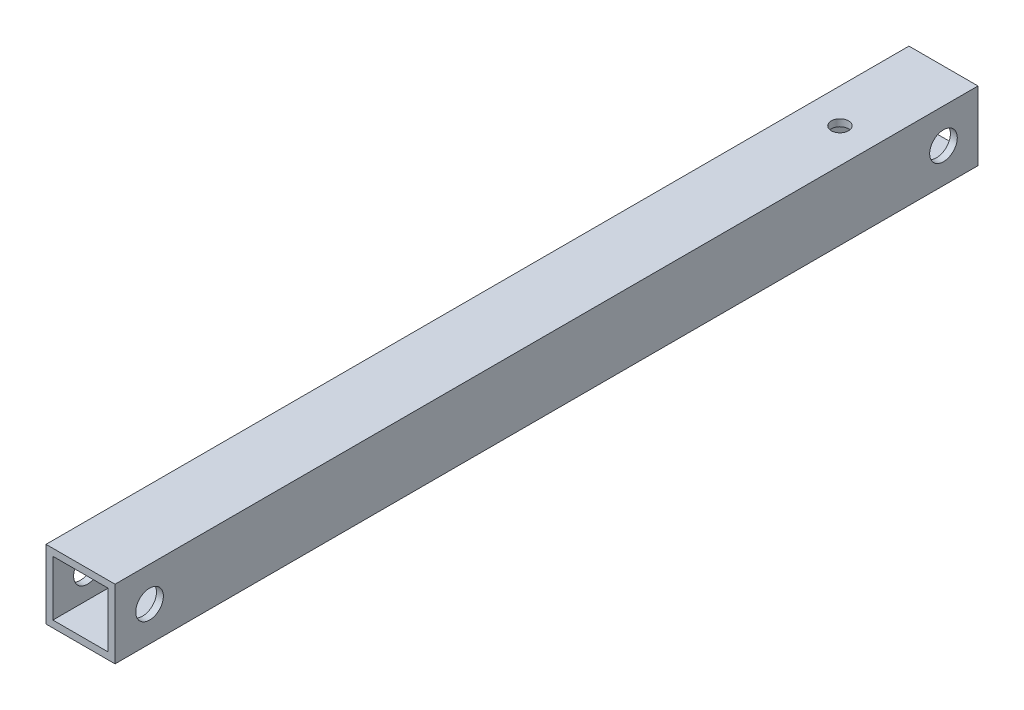
ISO-10303-21;
HEADER;
FILE_DESCRIPTION(('STEP AP214'),'2;1');
FILE_NAME('part.step','',(''),(''),'','','');
FILE_SCHEMA(('AUTOMOTIVE_DESIGN { 1 0 10303 214 1 1 1 1 }'));
ENDSEC;
DATA;
#1=APPLICATION_CONTEXT('core data for automotive mechanical design processes');
#2=APPLICATION_PROTOCOL_DEFINITION('international standard','automotive_design',2000,#1);
#3=PRODUCT_CONTEXT('',#1,'mechanical');
#4=PRODUCT('Part','Part','',(#3));
#5=PRODUCT_RELATED_PRODUCT_CATEGORY('part','',(#4));
#6=PRODUCT_DEFINITION_FORMATION('','',#4);
#7=PRODUCT_DEFINITION_CONTEXT('part definition',#1,'design');
#8=PRODUCT_DEFINITION('design','',#6,#7);
#9=PRODUCT_DEFINITION_SHAPE('','',#8);
#10=(LENGTH_UNIT() NAMED_UNIT(*) SI_UNIT(.MILLI.,.METRE.));
#11=(NAMED_UNIT(*) PLANE_ANGLE_UNIT() SI_UNIT($,.RADIAN.));
#12=(NAMED_UNIT(*) SI_UNIT($,.STERADIAN.) SOLID_ANGLE_UNIT());
#13=UNCERTAINTY_MEASURE_WITH_UNIT(LENGTH_MEASURE(1.E-05),#10,'distance_accuracy_value','');
#14=(GEOMETRIC_REPRESENTATION_CONTEXT(3) GLOBAL_UNCERTAINTY_ASSIGNED_CONTEXT((#13)) GLOBAL_UNIT_ASSIGNED_CONTEXT((#10,
#11,#12)) REPRESENTATION_CONTEXT('',''));
#15=CARTESIAN_POINT('',(0.,0.,0.));
#16=DIRECTION('',(0.,0.,1.));
#17=DIRECTION('',(1.,0.,0.));
#18=AXIS2_PLACEMENT_3D('',#15,#16,#17);
#19=CARTESIAN_POINT('',(0.,0.,250.));
#20=DIRECTION('',(0.,0.,-1.));
#21=DIRECTION('',(-1.,0.,0.));
#22=AXIS2_PLACEMENT_3D('',#19,#20,#21);
#23=PLANE('',#22);
#24=DIRECTION('',(0.,1.,0.));
#25=VECTOR('',#24,1.);
#26=CARTESIAN_POINT('',(10.,-10.,250.));
#27=LINE('',#26,#25);
#28=CARTESIAN_POINT('',(10.,-10.,250.));
#29=VERTEX_POINT('',#28);
#30=CARTESIAN_POINT('',(10.,10.,250.));
#31=VERTEX_POINT('',#30);
#32=EDGE_CURVE('E163',#29,#31,#27,.T.);
#33=ORIENTED_EDGE('',*,*,#32,.T.);
#34=DIRECTION('',(-1.,0.,0.));
#35=VECTOR('',#34,1.);
#36=CARTESIAN_POINT('',(-10.,10.,250.));
#37=LINE('',#36,#35);
#38=CARTESIAN_POINT('',(-10.,10.,250.));
#39=VERTEX_POINT('',#38);
#40=EDGE_CURVE('E167',#31,#39,#37,.T.);
#41=ORIENTED_EDGE('',*,*,#40,.T.);
#42=DIRECTION('',(0.,-1.,0.));
#43=VECTOR('',#42,1.);
#44=CARTESIAN_POINT('',(-10.,-10.,250.));
#45=LINE('',#44,#43);
#46=CARTESIAN_POINT('',(-10.,-10.,250.));
#47=VERTEX_POINT('',#46);
#48=EDGE_CURVE('E171',#39,#47,#45,.T.);
#49=ORIENTED_EDGE('',*,*,#48,.T.);
#50=DIRECTION('',(1.,0.,0.));
#51=VECTOR('',#50,1.);
#52=CARTESIAN_POINT('',(-10.,-10.,250.));
#53=LINE('',#52,#51);
#54=EDGE_CURVE('E174',#47,#29,#53,.T.);
#55=ORIENTED_EDGE('',*,*,#54,.T.);
#56=EDGE_LOOP('',(#33,#41,#49,#55));
#57=FACE_BOUND('',#56,.T.);
#58=DIRECTION('',(0.,-1.,0.));
#59=VECTOR('',#58,1.);
#60=CARTESIAN_POINT('',(-8.,-8.,250.));
#61=LINE('',#60,#59);
#62=CARTESIAN_POINT('',(-8.,8.,250.));
#63=VERTEX_POINT('',#62);
#64=CARTESIAN_POINT('',(-8.,-8.,250.));
#65=VERTEX_POINT('',#64);
#66=EDGE_CURVE('E113',#63,#65,#61,.T.);
#67=ORIENTED_EDGE('',*,*,#66,.F.);
#68=DIRECTION('',(-1.,0.,0.));
#69=VECTOR('',#68,1.);
#70=CARTESIAN_POINT('',(-8.,8.,250.));
#71=LINE('',#70,#69);
#72=CARTESIAN_POINT('',(8.,8.,250.));
#73=VERTEX_POINT('',#72);
#74=EDGE_CURVE('E139',#73,#63,#71,.T.);
#75=ORIENTED_EDGE('',*,*,#74,.F.);
#76=DIRECTION('',(0.,1.,0.));
#77=VECTOR('',#76,1.);
#78=CARTESIAN_POINT('',(8.,-8.,250.));
#79=LINE('',#78,#77);
#80=CARTESIAN_POINT('',(8.,-8.,250.));
#81=VERTEX_POINT('',#80);
#82=EDGE_CURVE('E135',#81,#73,#79,.T.);
#83=ORIENTED_EDGE('',*,*,#82,.F.);
#84=DIRECTION('',(1.,0.,0.));
#85=VECTOR('',#84,1.);
#86=CARTESIAN_POINT('',(-8.,-8.,250.));
#87=LINE('',#86,#85);
#88=EDGE_CURVE('E122',#65,#81,#87,.T.);
#89=ORIENTED_EDGE('',*,*,#88,.F.);
#90=EDGE_LOOP('',(#67,#75,#83,#89));
#91=FACE_BOUND('',#90,.T.);
#92=ADVANCED_FACE('F45',(#57,#91),#23,.F.);
#93=CARTESIAN_POINT('',(0.,0.,0.));
#94=DIRECTION('',(0.,0.,-1.));
#95=DIRECTION('',(-1.,0.,0.));
#96=AXIS2_PLACEMENT_3D('',#93,#94,#95);
#97=PLANE('',#96);
#98=DIRECTION('',(0.,1.,0.));
#99=VECTOR('',#98,1.);
#100=CARTESIAN_POINT('',(10.,-10.,0.));
#101=LINE('',#100,#99);
#102=CARTESIAN_POINT('',(10.,-10.,0.));
#103=VERTEX_POINT('',#102);
#104=CARTESIAN_POINT('',(10.,10.,0.));
#105=VERTEX_POINT('',#104);
#106=EDGE_CURVE('E131',#103,#105,#101,.T.);
#107=ORIENTED_EDGE('',*,*,#106,.F.);
#108=DIRECTION('',(1.,0.,0.));
#109=VECTOR('',#108,1.);
#110=CARTESIAN_POINT('',(-10.,-10.,0.));
#111=LINE('',#110,#109);
#112=CARTESIAN_POINT('',(-10.,-10.,0.));
#113=VERTEX_POINT('',#112);
#114=EDGE_CURVE('E168',#113,#103,#111,.T.);
#115=ORIENTED_EDGE('',*,*,#114,.F.);
#116=DIRECTION('',(0.,-1.,0.));
#117=VECTOR('',#116,1.);
#118=CARTESIAN_POINT('',(-10.,-10.,0.));
#119=LINE('',#118,#117);
#120=CARTESIAN_POINT('',(-10.,10.,0.));
#121=VERTEX_POINT('',#120);
#122=EDGE_CURVE('E184',#121,#113,#119,.T.);
#123=ORIENTED_EDGE('',*,*,#122,.F.);
#124=DIRECTION('',(-1.,0.,0.));
#125=VECTOR('',#124,1.);
#126=CARTESIAN_POINT('',(-10.,10.,0.));
#127=LINE('',#126,#125);
#128=EDGE_CURVE('E181',#105,#121,#127,.T.);
#129=ORIENTED_EDGE('',*,*,#128,.F.);
#130=EDGE_LOOP('',(#107,#115,#123,#129));
#131=FACE_BOUND('',#130,.T.);
#132=DIRECTION('',(-1.,0.,0.));
#133=VECTOR('',#132,1.);
#134=CARTESIAN_POINT('',(-8.,8.,0.));
#135=LINE('',#134,#133);
#136=CARTESIAN_POINT('',(8.,8.,0.));
#137=VERTEX_POINT('',#136);
#138=CARTESIAN_POINT('',(-8.,8.,0.));
#139=VERTEX_POINT('',#138);
#140=EDGE_CURVE('E123',#137,#139,#135,.T.);
#141=ORIENTED_EDGE('',*,*,#140,.T.);
#142=DIRECTION('',(0.,-1.,0.));
#143=VECTOR('',#142,1.);
#144=CARTESIAN_POINT('',(-8.,-8.,0.));
#145=LINE('',#144,#143);
#146=CARTESIAN_POINT('',(-8.,-8.,0.));
#147=VERTEX_POINT('',#146);
#148=EDGE_CURVE('E71',#139,#147,#145,.T.);
#149=ORIENTED_EDGE('',*,*,#148,.T.);
#150=DIRECTION('',(1.,0.,0.));
#151=VECTOR('',#150,1.);
#152=CARTESIAN_POINT('',(-8.,-8.,0.));
#153=LINE('',#152,#151);
#154=CARTESIAN_POINT('',(8.,-8.,0.));
#155=VERTEX_POINT('',#154);
#156=EDGE_CURVE('E129',#147,#155,#153,.T.);
#157=ORIENTED_EDGE('',*,*,#156,.T.);
#158=DIRECTION('',(0.,1.,0.));
#159=VECTOR('',#158,1.);
#160=CARTESIAN_POINT('',(8.,-8.,0.));
#161=LINE('',#160,#159);
#162=EDGE_CURVE('E150',#155,#137,#161,.T.);
#163=ORIENTED_EDGE('',*,*,#162,.T.);
#164=EDGE_LOOP('',(#141,#149,#157,#163));
#165=FACE_BOUND('',#164,.T.);
#166=ADVANCED_FACE('F259',(#131,#165),#97,.T.);
#167=CARTESIAN_POINT('',(10.,-10.,250.));
#168=DIRECTION('',(-1.,0.,0.));
#169=DIRECTION('',(0.,0.,1.));
#170=AXIS2_PLACEMENT_3D('',#167,#168,#169);
#171=PLANE('',#170);
#172=CARTESIAN_POINT('',(10.,0.,10.));
#173=DIRECTION('',(1.,0.,0.));
#174=DIRECTION('',(0.,0.,-1.));
#175=AXIS2_PLACEMENT_3D('',#172,#173,#174);
#176=CIRCLE('',#175,4.);
#177=CARTESIAN_POINT('',(10.,0.,6.));
#178=VERTEX_POINT('',#177);
#179=EDGE_CURVE('E226',#178,#178,#176,.T.);
#180=ORIENTED_EDGE('',*,*,#179,.F.);
#181=EDGE_LOOP('',(#180));
#182=FACE_BOUND('',#181,.T.);
#183=CARTESIAN_POINT('',(10.,0.,240.));
#184=DIRECTION('',(1.,0.,0.));
#185=DIRECTION('',(0.,0.,-1.));
#186=AXIS2_PLACEMENT_3D('',#183,#184,#185);
#187=CIRCLE('',#186,3.99999999999999);
#188=CARTESIAN_POINT('',(10.,0.,236.));
#189=VERTEX_POINT('',#188);
#190=EDGE_CURVE('E221',#189,#189,#187,.T.);
#191=ORIENTED_EDGE('',*,*,#190,.F.);
#192=EDGE_LOOP('',(#191));
#193=FACE_BOUND('',#192,.T.);
#194=ORIENTED_EDGE('',*,*,#106,.T.);
#195=DIRECTION('',(0.,0.,-1.));
#196=VECTOR('',#195,1.);
#197=CARTESIAN_POINT('',(10.,10.,250.));
#198=LINE('',#197,#196);
#199=EDGE_CURVE('E11',#31,#105,#198,.T.);
#200=ORIENTED_EDGE('',*,*,#199,.F.);
#201=ORIENTED_EDGE('',*,*,#32,.F.);
#202=DIRECTION('',(0.,0.,-1.));
#203=VECTOR('',#202,1.);
#204=CARTESIAN_POINT('',(10.,-10.,250.));
#205=LINE('',#204,#203);
#206=EDGE_CURVE('E177',#29,#103,#205,.T.);
#207=ORIENTED_EDGE('',*,*,#206,.T.);
#208=EDGE_LOOP('',(#194,#200,#201,#207));
#209=FACE_BOUND('',#208,.T.);
#210=ADVANCED_FACE('F47',(#182,#193,#209),#171,.F.);
#211=CARTESIAN_POINT('',(-10.,10.,250.));
#212=DIRECTION('',(0.,-1.,0.));
#213=DIRECTION('',(0.,0.,-1.));
#214=AXIS2_PLACEMENT_3D('',#211,#212,#213);
#215=PLANE('',#214);
#216=CARTESIAN_POINT('',(0.,10.,30.));
#217=DIRECTION('',(0.,1.,0.));
#218=DIRECTION('',(0.,0.,1.));
#219=AXIS2_PLACEMENT_3D('',#216,#217,#218);
#220=CIRCLE('',#219,2.5);
#221=CARTESIAN_POINT('',(0.,10.,32.5));
#222=VERTEX_POINT('',#221);
#223=EDGE_CURVE('E236',#222,#222,#220,.T.);
#224=ORIENTED_EDGE('',*,*,#223,.F.);
#225=EDGE_LOOP('',(#224));
#226=FACE_BOUND('',#225,.T.);
#227=ORIENTED_EDGE('',*,*,#128,.T.);
#228=DIRECTION('',(0.,0.,-1.));
#229=VECTOR('',#228,1.);
#230=CARTESIAN_POINT('',(-10.,10.,250.));
#231=LINE('',#230,#229);
#232=EDGE_CURVE('E55',#39,#121,#231,.T.);
#233=ORIENTED_EDGE('',*,*,#232,.F.);
#234=ORIENTED_EDGE('',*,*,#40,.F.);
#235=ORIENTED_EDGE('',*,*,#199,.T.);
#236=EDGE_LOOP('',(#227,#233,#234,#235));
#237=FACE_BOUND('',#236,.T.);
#238=ADVANCED_FACE('F287',(#226,#237),#215,.F.);
#239=CARTESIAN_POINT('',(-10.,-10.,250.));
#240=DIRECTION('',(1.,0.,0.));
#241=DIRECTION('',(0.,0.,-1.));
#242=AXIS2_PLACEMENT_3D('',#239,#240,#241);
#243=PLANE('',#242);
#244=CARTESIAN_POINT('',(-10.,0.,10.));
#245=DIRECTION('',(1.,0.,0.));
#246=DIRECTION('',(0.,0.,-1.));
#247=AXIS2_PLACEMENT_3D('',#244,#245,#246);
#248=CIRCLE('',#247,4.);
#249=CARTESIAN_POINT('',(-10.,0.,6.));
#250=VERTEX_POINT('',#249);
#251=EDGE_CURVE('E203',#250,#250,#248,.T.);
#252=ORIENTED_EDGE('',*,*,#251,.T.);
#253=EDGE_LOOP('',(#252));
#254=FACE_BOUND('',#253,.T.);
#255=CARTESIAN_POINT('',(-10.,0.,240.));
#256=DIRECTION('',(1.,0.,0.));
#257=DIRECTION('',(0.,0.,-1.));
#258=AXIS2_PLACEMENT_3D('',#255,#256,#257);
#259=CIRCLE('',#258,3.99999999999999);
#260=CARTESIAN_POINT('',(-10.,0.,236.));
#261=VERTEX_POINT('',#260);
#262=EDGE_CURVE('E217',#261,#261,#259,.T.);
#263=ORIENTED_EDGE('',*,*,#262,.T.);
#264=EDGE_LOOP('',(#263));
#265=FACE_BOUND('',#264,.T.);
#266=ORIENTED_EDGE('',*,*,#122,.T.);
#267=DIRECTION('',(0.,0.,-1.));
#268=VECTOR('',#267,1.);
#269=CARTESIAN_POINT('',(-10.,-10.,250.));
#270=LINE('',#269,#268);
#271=EDGE_CURVE('E192',#47,#113,#270,.T.);
#272=ORIENTED_EDGE('',*,*,#271,.F.);
#273=ORIENTED_EDGE('',*,*,#48,.F.);
#274=ORIENTED_EDGE('',*,*,#232,.T.);
#275=EDGE_LOOP('',(#266,#272,#273,#274));
#276=FACE_BOUND('',#275,.T.);
#277=ADVANCED_FACE('F285',(#254,#265,#276),#243,.F.);
#278=CARTESIAN_POINT('',(-10.,-10.,250.));
#279=DIRECTION('',(0.,1.,0.));
#280=DIRECTION('',(0.,0.,1.));
#281=AXIS2_PLACEMENT_3D('',#278,#279,#280);
#282=PLANE('',#281);
#283=CARTESIAN_POINT('',(0.,-10.,30.));
#284=DIRECTION('',(0.,1.,0.));
#285=DIRECTION('',(0.,0.,1.));
#286=AXIS2_PLACEMENT_3D('',#283,#284,#285);
#287=CIRCLE('',#286,2.5);
#288=CARTESIAN_POINT('',(0.,-10.,32.5));
#289=VERTEX_POINT('',#288);
#290=EDGE_CURVE('E240',#289,#289,#287,.T.);
#291=ORIENTED_EDGE('',*,*,#290,.T.);
#292=EDGE_LOOP('',(#291));
#293=FACE_BOUND('',#292,.T.);
#294=ORIENTED_EDGE('',*,*,#114,.T.);
#295=ORIENTED_EDGE('',*,*,#206,.F.);
#296=ORIENTED_EDGE('',*,*,#54,.F.);
#297=ORIENTED_EDGE('',*,*,#271,.T.);
#298=EDGE_LOOP('',(#294,#295,#296,#297));
#299=FACE_BOUND('',#298,.T.);
#300=ADVANCED_FACE('F282',(#293,#299),#282,.F.);
#301=CARTESIAN_POINT('',(-8.,-8.,250.));
#302=DIRECTION('',(1.,0.,0.));
#303=DIRECTION('',(0.,0.,-1.));
#304=AXIS2_PLACEMENT_3D('',#301,#302,#303);
#305=PLANE('',#304);
#306=CARTESIAN_POINT('',(-8.,0.,10.));
#307=DIRECTION('',(1.,0.,0.));
#308=DIRECTION('',(0.,0.,-1.));
#309=AXIS2_PLACEMENT_3D('',#306,#307,#308);
#310=CIRCLE('',#309,4.);
#311=CARTESIAN_POINT('',(-8.,0.,6.));
#312=VERTEX_POINT('',#311);
#313=EDGE_CURVE('E147',#312,#312,#310,.T.);
#314=ORIENTED_EDGE('',*,*,#313,.F.);
#315=EDGE_LOOP('',(#314));
#316=FACE_BOUND('',#315,.T.);
#317=CARTESIAN_POINT('',(-8.,0.,240.));
#318=DIRECTION('',(1.,0.,0.));
#319=DIRECTION('',(0.,0.,-1.));
#320=AXIS2_PLACEMENT_3D('',#317,#318,#319);
#321=CIRCLE('',#320,3.99999999999999);
#322=CARTESIAN_POINT('',(-8.,0.,236.));
#323=VERTEX_POINT('',#322);
#324=EDGE_CURVE('E202',#323,#323,#321,.T.);
#325=ORIENTED_EDGE('',*,*,#324,.F.);
#326=EDGE_LOOP('',(#325));
#327=FACE_BOUND('',#326,.T.);
#328=ORIENTED_EDGE('',*,*,#148,.F.);
#329=DIRECTION('',(0.,0.,-1.));
#330=VECTOR('',#329,1.);
#331=CARTESIAN_POINT('',(-8.,8.,250.));
#332=LINE('',#331,#330);
#333=EDGE_CURVE('E117',#63,#139,#332,.T.);
#334=ORIENTED_EDGE('',*,*,#333,.F.);
#335=ORIENTED_EDGE('',*,*,#66,.T.);
#336=DIRECTION('',(0.,0.,-1.));
#337=VECTOR('',#336,1.);
#338=CARTESIAN_POINT('',(-8.,-8.,250.));
#339=LINE('',#338,#337);
#340=EDGE_CURVE('E116',#65,#147,#339,.T.);
#341=ORIENTED_EDGE('',*,*,#340,.T.);
#342=EDGE_LOOP('',(#328,#334,#335,#341));
#343=FACE_BOUND('',#342,.T.);
#344=ADVANCED_FACE('F115',(#316,#327,#343),#305,.T.);
#345=CARTESIAN_POINT('',(-8.,-8.,250.));
#346=DIRECTION('',(0.,1.,0.));
#347=DIRECTION('',(0.,0.,1.));
#348=AXIS2_PLACEMENT_3D('',#345,#346,#347);
#349=PLANE('',#348);
#350=CARTESIAN_POINT('',(0.,-8.,30.));
#351=DIRECTION('',(0.,1.,0.));
#352=DIRECTION('',(0.,0.,1.));
#353=AXIS2_PLACEMENT_3D('',#350,#351,#352);
#354=CIRCLE('',#353,2.5);
#355=CARTESIAN_POINT('',(0.,-8.,32.5));
#356=VERTEX_POINT('',#355);
#357=EDGE_CURVE('E222',#356,#356,#354,.T.);
#358=ORIENTED_EDGE('',*,*,#357,.F.);
#359=EDGE_LOOP('',(#358));
#360=FACE_BOUND('',#359,.T.);
#361=ORIENTED_EDGE('',*,*,#156,.F.);
#362=ORIENTED_EDGE('',*,*,#340,.F.);
#363=ORIENTED_EDGE('',*,*,#88,.T.);
#364=DIRECTION('',(0.,0.,-1.));
#365=VECTOR('',#364,1.);
#366=CARTESIAN_POINT('',(8.,-8.,250.));
#367=LINE('',#366,#365);
#368=EDGE_CURVE('E132',#81,#155,#367,.T.);
#369=ORIENTED_EDGE('',*,*,#368,.T.);
#370=EDGE_LOOP('',(#361,#362,#363,#369));
#371=FACE_BOUND('',#370,.T.);
#372=ADVANCED_FACE('F126',(#360,#371),#349,.T.);
#373=CARTESIAN_POINT('',(8.,-8.,250.));
#374=DIRECTION('',(-1.,0.,0.));
#375=DIRECTION('',(0.,-1.,0.));
#376=AXIS2_PLACEMENT_3D('',#373,#374,#375);
#377=PLANE('',#376);
#378=CARTESIAN_POINT('',(8.,0.,10.));
#379=DIRECTION('',(-1.,0.,0.));
#380=DIRECTION('',(0.,-1.,0.));
#381=AXIS2_PLACEMENT_3D('',#378,#379,#380);
#382=CIRCLE('',#381,4.);
#383=CARTESIAN_POINT('',(8.,-4.,10.));
#384=VERTEX_POINT('',#383);
#385=EDGE_CURVE('E204',#384,#384,#382,.T.);
#386=ORIENTED_EDGE('',*,*,#385,.F.);
#387=EDGE_LOOP('',(#386));
#388=FACE_BOUND('',#387,.T.);
#389=CARTESIAN_POINT('',(8.,0.,240.));
#390=DIRECTION('',(-1.,0.,0.));
#391=DIRECTION('',(0.,-1.,0.));
#392=AXIS2_PLACEMENT_3D('',#389,#390,#391);
#393=CIRCLE('',#392,3.99999999999999);
#394=CARTESIAN_POINT('',(8.,-3.99999999999999,240.));
#395=VERTEX_POINT('',#394);
#396=EDGE_CURVE('E199',#395,#395,#393,.T.);
#397=ORIENTED_EDGE('',*,*,#396,.F.);
#398=EDGE_LOOP('',(#397));
#399=FACE_BOUND('',#398,.T.);
#400=ORIENTED_EDGE('',*,*,#162,.F.);
#401=ORIENTED_EDGE('',*,*,#368,.F.);
#402=ORIENTED_EDGE('',*,*,#82,.T.);
#403=DIRECTION('',(0.,0.,-1.));
#404=VECTOR('',#403,1.);
#405=CARTESIAN_POINT('',(8.,8.,250.));
#406=LINE('',#405,#404);
#407=EDGE_CURVE('E63',#73,#137,#406,.T.);
#408=ORIENTED_EDGE('',*,*,#407,.T.);
#409=EDGE_LOOP('',(#400,#401,#402,#408));
#410=FACE_BOUND('',#409,.T.);
#411=ADVANCED_FACE('F255',(#388,#399,#410),#377,.T.);
#412=CARTESIAN_POINT('',(-8.,8.,250.));
#413=DIRECTION('',(0.,-1.,0.));
#414=DIRECTION('',(1.,0.,0.));
#415=AXIS2_PLACEMENT_3D('',#412,#413,#414);
#416=PLANE('',#415);
#417=CARTESIAN_POINT('',(0.,8.,30.));
#418=DIRECTION('',(0.,-1.,0.));
#419=DIRECTION('',(1.,0.,0.));
#420=AXIS2_PLACEMENT_3D('',#417,#418,#419);
#421=CIRCLE('',#420,2.5);
#422=CARTESIAN_POINT('',(2.5,8.,30.));
#423=VERTEX_POINT('',#422);
#424=EDGE_CURVE('E49',#423,#423,#421,.T.);
#425=ORIENTED_EDGE('',*,*,#424,.F.);
#426=EDGE_LOOP('',(#425));
#427=FACE_BOUND('',#426,.T.);
#428=ORIENTED_EDGE('',*,*,#140,.F.);
#429=ORIENTED_EDGE('',*,*,#407,.F.);
#430=ORIENTED_EDGE('',*,*,#74,.T.);
#431=ORIENTED_EDGE('',*,*,#333,.T.);
#432=EDGE_LOOP('',(#428,#429,#430,#431));
#433=FACE_BOUND('',#432,.T.);
#434=ADVANCED_FACE('F252',(#427,#433),#416,.T.);
#435=CARTESIAN_POINT('',(-10.,0.,240.));
#436=DIRECTION('',(1.,0.,0.));
#437=DIRECTION('',(0.,0.,-1.));
#438=AXIS2_PLACEMENT_3D('',#435,#436,#437);
#439=CYLINDRICAL_SURFACE('',#438,3.99999999999999);
#440=ORIENTED_EDGE('',*,*,#396,.T.);
#441=EDGE_LOOP('',(#440));
#442=FACE_BOUND('',#441,.T.);
#443=ORIENTED_EDGE('',*,*,#190,.T.);
#444=EDGE_LOOP('',(#443));
#445=FACE_BOUND('',#444,.T.);
#446=ADVANCED_FACE('F254',(#442,#445),#439,.F.);
#447=CARTESIAN_POINT('',(-10.,0.,10.));
#448=DIRECTION('',(1.,0.,0.));
#449=DIRECTION('',(0.,0.,-1.));
#450=AXIS2_PLACEMENT_3D('',#447,#448,#449);
#451=CYLINDRICAL_SURFACE('',#450,4.);
#452=ORIENTED_EDGE('',*,*,#385,.T.);
#453=EDGE_LOOP('',(#452));
#454=FACE_BOUND('',#453,.T.);
#455=ORIENTED_EDGE('',*,*,#179,.T.);
#456=EDGE_LOOP('',(#455));
#457=FACE_BOUND('',#456,.T.);
#458=ADVANCED_FACE('F322',(#454,#457),#451,.F.);
#459=ORIENTED_EDGE('',*,*,#324,.T.);
#460=EDGE_LOOP('',(#459));
#461=FACE_BOUND('',#460,.T.);
#462=ORIENTED_EDGE('',*,*,#262,.F.);
#463=EDGE_LOOP('',(#462));
#464=FACE_BOUND('',#463,.T.);
#465=ADVANCED_FACE('F319',(#461,#464),#439,.F.);
#466=ORIENTED_EDGE('',*,*,#313,.T.);
#467=EDGE_LOOP('',(#466));
#468=FACE_BOUND('',#467,.T.);
#469=ORIENTED_EDGE('',*,*,#251,.F.);
#470=EDGE_LOOP('',(#469));
#471=FACE_BOUND('',#470,.T.);
#472=ADVANCED_FACE('F313',(#468,#471),#451,.F.);
#473=CARTESIAN_POINT('',(0.,-10.,30.));
#474=DIRECTION('',(0.,1.,0.));
#475=DIRECTION('',(0.,0.,1.));
#476=AXIS2_PLACEMENT_3D('',#473,#474,#475);
#477=CYLINDRICAL_SURFACE('',#476,2.5);
#478=ORIENTED_EDGE('',*,*,#424,.T.);
#479=EDGE_LOOP('',(#478));
#480=FACE_BOUND('',#479,.T.);
#481=ORIENTED_EDGE('',*,*,#223,.T.);
#482=EDGE_LOOP('',(#481));
#483=FACE_BOUND('',#482,.T.);
#484=ADVANCED_FACE('F249',(#480,#483),#477,.F.);
#485=ORIENTED_EDGE('',*,*,#357,.T.);
#486=EDGE_LOOP('',(#485));
#487=FACE_BOUND('',#486,.T.);
#488=ORIENTED_EDGE('',*,*,#290,.F.);
#489=EDGE_LOOP('',(#488));
#490=FACE_BOUND('',#489,.T.);
#491=ADVANCED_FACE('F312',(#487,#490),#477,.F.);
#492=CLOSED_SHELL('',(#92,#166,#210,#238,#277,#300,#344,#372,#411,#434,#446,#458,#465,#472,#484,#491));
#493=MANIFOLD_SOLID_BREP('B2',#492);
#494=ADVANCED_BREP_SHAPE_REPRESENTATION('',(#18,#493),#14);
#495=SHAPE_DEFINITION_REPRESENTATION(#9,#494);
ENDSEC;
END-ISO-10303-21;
